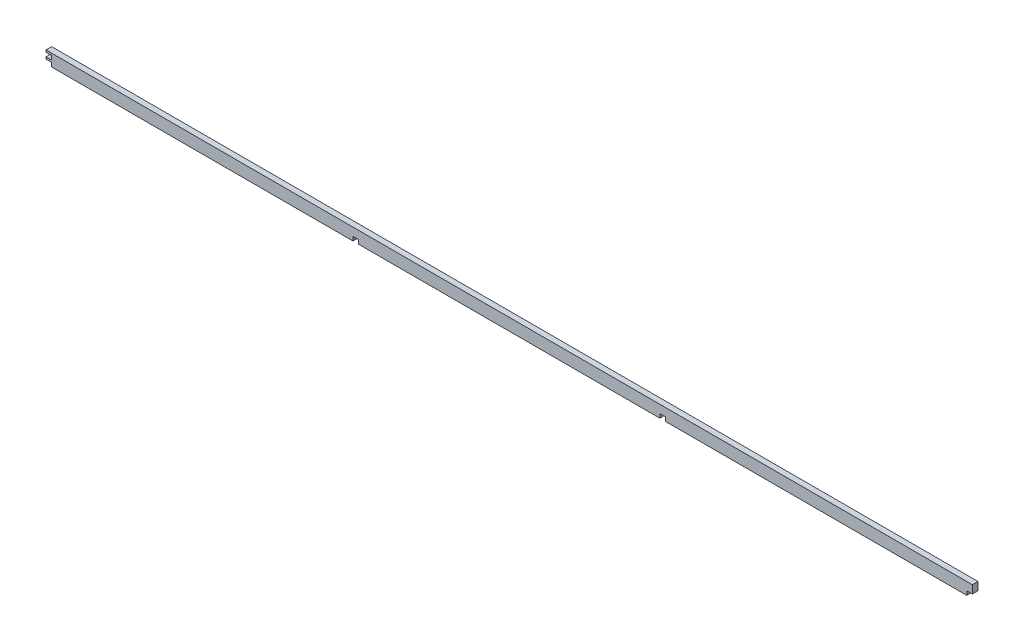
ISO-10303-21;
HEADER;
FILE_DESCRIPTION(('STEP AP214'),'2;1');
FILE_NAME('part.step','',(''),(''),'','','');
FILE_SCHEMA(('AUTOMOTIVE_DESIGN { 1 0 10303 214 1 1 1 1 }'));
ENDSEC;
DATA;
#1=APPLICATION_CONTEXT('core data for automotive mechanical design processes');
#2=APPLICATION_PROTOCOL_DEFINITION('international standard','automotive_design',2000,#1);
#3=PRODUCT_CONTEXT('',#1,'mechanical');
#4=PRODUCT('Part','Part','',(#3));
#5=PRODUCT_RELATED_PRODUCT_CATEGORY('part','',(#4));
#6=PRODUCT_DEFINITION_FORMATION('','',#4);
#7=PRODUCT_DEFINITION_CONTEXT('part definition',#1,'design');
#8=PRODUCT_DEFINITION('design','',#6,#7);
#9=PRODUCT_DEFINITION_SHAPE('','',#8);
#10=(LENGTH_UNIT() NAMED_UNIT(*) SI_UNIT(.MILLI.,.METRE.));
#11=(NAMED_UNIT(*) PLANE_ANGLE_UNIT() SI_UNIT($,.RADIAN.));
#12=(NAMED_UNIT(*) SI_UNIT($,.STERADIAN.) SOLID_ANGLE_UNIT());
#13=UNCERTAINTY_MEASURE_WITH_UNIT(LENGTH_MEASURE(1.E-05),#10,'distance_accuracy_value','');
#14=(GEOMETRIC_REPRESENTATION_CONTEXT(3) GLOBAL_UNCERTAINTY_ASSIGNED_CONTEXT((#13)) GLOBAL_UNIT_ASSIGNED_CONTEXT((#10,
#11,#12)) REPRESENTATION_CONTEXT('',''));
#15=CARTESIAN_POINT('',(0.,0.,0.));
#16=DIRECTION('',(0.,0.,1.));
#17=DIRECTION('',(1.,0.,0.));
#18=AXIS2_PLACEMENT_3D('',#15,#16,#17);
#19=CARTESIAN_POINT('',(229.199999999999,-0.999999999999996,1.4));
#20=DIRECTION('',(-1.,0.,0.));
#21=DIRECTION('',(0.,0.,1.));
#22=AXIS2_PLACEMENT_3D('',#19,#20,#21);
#23=PLANE('',#22);
#24=DIRECTION('',(0.,1.,0.));
#25=VECTOR('',#24,1.);
#26=CARTESIAN_POINT('',(229.199999999999,-0.999999999999996,-1.4));
#27=LINE('',#26,#25);
#28=CARTESIAN_POINT('',(229.199999999999,-0.999999999999996,-1.4));
#29=VERTEX_POINT('',#28);
#30=CARTESIAN_POINT('',(229.199999999999,3.,-1.4));
#31=VERTEX_POINT('',#30);
#32=EDGE_CURVE('E201',#29,#31,#27,.T.);
#33=ORIENTED_EDGE('',*,*,#32,.T.);
#34=DIRECTION('',(0.,0.,-1.));
#35=VECTOR('',#34,1.);
#36=CARTESIAN_POINT('',(229.199999999999,3.,1.4));
#37=LINE('',#36,#35);
#38=CARTESIAN_POINT('',(229.199999999999,3.,1.4));
#39=VERTEX_POINT('',#38);
#40=EDGE_CURVE('E11',#39,#31,#37,.T.);
#41=ORIENTED_EDGE('',*,*,#40,.F.);
#42=DIRECTION('',(0.,1.,0.));
#43=VECTOR('',#42,1.);
#44=CARTESIAN_POINT('',(229.199999999999,-0.999999999999996,1.4));
#45=LINE('',#44,#43);
#46=CARTESIAN_POINT('',(229.199999999999,-0.999999999999996,1.4));
#47=VERTEX_POINT('',#46);
#48=EDGE_CURVE('E239',#47,#39,#45,.T.);
#49=ORIENTED_EDGE('',*,*,#48,.F.);
#50=DIRECTION('',(0.,0.,-1.));
#51=VECTOR('',#50,1.);
#52=CARTESIAN_POINT('',(229.199999999999,-0.999999999999996,1.4));
#53=LINE('',#52,#51);
#54=EDGE_CURVE('E197',#47,#29,#53,.T.);
#55=ORIENTED_EDGE('',*,*,#54,.T.);
#56=EDGE_LOOP('',(#33,#41,#49,#55));
#57=FACE_BOUND('',#56,.T.);
#58=ADVANCED_FACE('F33',(#57),#23,.F.);
#59=CARTESIAN_POINT('',(-232.,3.,1.4));
#60=DIRECTION('',(0.,-1.,0.));
#61=DIRECTION('',(1.,0.,0.));
#62=AXIS2_PLACEMENT_3D('',#59,#60,#61);
#63=PLANE('',#62);
#64=DIRECTION('',(-1.,0.,0.));
#65=VECTOR('',#64,1.);
#66=CARTESIAN_POINT('',(-232.,3.,-1.4));
#67=LINE('',#66,#65);
#68=CARTESIAN_POINT('',(-232.,3.,-1.4));
#69=VERTEX_POINT('',#68);
#70=EDGE_CURVE('E204',#31,#69,#67,.T.);
#71=ORIENTED_EDGE('',*,*,#70,.T.);
#72=DIRECTION('',(0.,0.,-1.));
#73=VECTOR('',#72,1.);
#74=CARTESIAN_POINT('',(-232.,3.,1.4));
#75=LINE('',#74,#73);
#76=CARTESIAN_POINT('',(-232.,3.,1.4));
#77=VERTEX_POINT('',#76);
#78=EDGE_CURVE('E41',#77,#69,#75,.T.);
#79=ORIENTED_EDGE('',*,*,#78,.F.);
#80=DIRECTION('',(-1.,0.,0.));
#81=VECTOR('',#80,1.);
#82=CARTESIAN_POINT('',(-229.200000000001,3.,1.4));
#83=LINE('',#82,#81);
#84=EDGE_CURVE('E128',#39,#77,#83,.T.);
#85=ORIENTED_EDGE('',*,*,#84,.F.);
#86=ORIENTED_EDGE('',*,*,#40,.T.);
#87=EDGE_LOOP('',(#71,#79,#85,#86));
#88=FACE_BOUND('',#87,.T.);
#89=ADVANCED_FACE('F357',(#88),#63,.F.);
#90=CARTESIAN_POINT('',(-232.,2.,1.4));
#91=DIRECTION('',(1.,0.,0.));
#92=DIRECTION('',(0.,0.,-1.));
#93=AXIS2_PLACEMENT_3D('',#90,#91,#92);
#94=PLANE('',#93);
#95=DIRECTION('',(0.,-1.,0.));
#96=VECTOR('',#95,1.);
#97=CARTESIAN_POINT('',(-232.,2.,-1.4));
#98=LINE('',#97,#96);
#99=CARTESIAN_POINT('',(-232.,2.,-1.4));
#100=VERTEX_POINT('',#99);
#101=EDGE_CURVE('E206',#69,#100,#98,.T.);
#102=ORIENTED_EDGE('',*,*,#101,.T.);
#103=DIRECTION('',(0.,0.,-1.));
#104=VECTOR('',#103,1.);
#105=CARTESIAN_POINT('',(-232.,2.,1.4));
#106=LINE('',#105,#104);
#107=CARTESIAN_POINT('',(-232.,2.,1.4));
#108=VERTEX_POINT('',#107);
#109=EDGE_CURVE('E282',#108,#100,#106,.T.);
#110=ORIENTED_EDGE('',*,*,#109,.F.);
#111=DIRECTION('',(0.,-1.,0.));
#112=VECTOR('',#111,1.);
#113=CARTESIAN_POINT('',(-232.,2.,1.4));
#114=LINE('',#113,#112);
#115=EDGE_CURVE('E290',#77,#108,#114,.T.);
#116=ORIENTED_EDGE('',*,*,#115,.F.);
#117=ORIENTED_EDGE('',*,*,#78,.T.);
#118=EDGE_LOOP('',(#102,#110,#116,#117));
#119=FACE_BOUND('',#118,.T.);
#120=ADVANCED_FACE('F288',(#119),#94,.F.);
#121=CARTESIAN_POINT('',(-229.200000000001,2.,1.4));
#122=DIRECTION('',(0.,1.,0.));
#123=DIRECTION('',(-1.,0.,0.));
#124=AXIS2_PLACEMENT_3D('',#121,#122,#123);
#125=PLANE('',#124);
#126=DIRECTION('',(1.,0.,0.));
#127=VECTOR('',#126,1.);
#128=CARTESIAN_POINT('',(-229.200000000001,2.,-1.4));
#129=LINE('',#128,#127);
#130=CARTESIAN_POINT('',(-229.200000000001,2.,-1.4));
#131=VERTEX_POINT('',#130);
#132=EDGE_CURVE('E208',#100,#131,#129,.T.);
#133=ORIENTED_EDGE('',*,*,#132,.T.);
#134=DIRECTION('',(0.,0.,-1.));
#135=VECTOR('',#134,1.);
#136=CARTESIAN_POINT('',(-229.200000000001,2.,1.4));
#137=LINE('',#136,#135);
#138=CARTESIAN_POINT('',(-229.200000000001,2.,1.4));
#139=VERTEX_POINT('',#138);
#140=EDGE_CURVE('E279',#139,#131,#137,.T.);
#141=ORIENTED_EDGE('',*,*,#140,.F.);
#142=DIRECTION('',(1.,0.,0.));
#143=VECTOR('',#142,1.);
#144=CARTESIAN_POINT('',(-229.200000000001,2.,1.4));
#145=LINE('',#144,#143);
#146=EDGE_CURVE('E308',#108,#139,#145,.T.);
#147=ORIENTED_EDGE('',*,*,#146,.F.);
#148=ORIENTED_EDGE('',*,*,#109,.T.);
#149=EDGE_LOOP('',(#133,#141,#147,#148));
#150=FACE_BOUND('',#149,.T.);
#151=ADVANCED_FACE('F299',(#150),#125,.F.);
#152=CARTESIAN_POINT('',(-229.200000000001,0.,1.4));
#153=DIRECTION('',(1.,0.,0.));
#154=DIRECTION('',(0.,0.,-1.));
#155=AXIS2_PLACEMENT_3D('',#152,#153,#154);
#156=PLANE('',#155);
#157=DIRECTION('',(0.,-1.,0.));
#158=VECTOR('',#157,1.);
#159=CARTESIAN_POINT('',(-229.200000000001,0.,-1.4));
#160=LINE('',#159,#158);
#161=CARTESIAN_POINT('',(-229.200000000001,0.,-1.4));
#162=VERTEX_POINT('',#161);
#163=EDGE_CURVE('E210',#131,#162,#160,.T.);
#164=ORIENTED_EDGE('',*,*,#163,.T.);
#165=DIRECTION('',(0.,0.,-1.));
#166=VECTOR('',#165,1.);
#167=CARTESIAN_POINT('',(-229.200000000001,0.,1.4));
#168=LINE('',#167,#166);
#169=CARTESIAN_POINT('',(-229.200000000001,0.,1.4));
#170=VERTEX_POINT('',#169);
#171=EDGE_CURVE('E276',#170,#162,#168,.T.);
#172=ORIENTED_EDGE('',*,*,#171,.F.);
#173=DIRECTION('',(0.,-1.,0.));
#174=VECTOR('',#173,1.);
#175=CARTESIAN_POINT('',(-229.200000000001,0.,1.4));
#176=LINE('',#175,#174);
#177=EDGE_CURVE('E305',#139,#170,#176,.T.);
#178=ORIENTED_EDGE('',*,*,#177,.F.);
#179=ORIENTED_EDGE('',*,*,#140,.T.);
#180=EDGE_LOOP('',(#164,#172,#178,#179));
#181=FACE_BOUND('',#180,.T.);
#182=ADVANCED_FACE('F303',(#181),#156,.F.);
#183=CARTESIAN_POINT('',(-229.200000000001,0.,1.4));
#184=DIRECTION('',(0.,-1.,0.));
#185=DIRECTION('',(1.,0.,0.));
#186=AXIS2_PLACEMENT_3D('',#183,#184,#185);
#187=PLANE('',#186);
#188=DIRECTION('',(-1.,0.,0.));
#189=VECTOR('',#188,1.);
#190=CARTESIAN_POINT('',(-229.200000000001,0.,-1.4));
#191=LINE('',#190,#189);
#192=CARTESIAN_POINT('',(-232.,0.,-1.4));
#193=VERTEX_POINT('',#192);
#194=EDGE_CURVE('E212',#162,#193,#191,.T.);
#195=ORIENTED_EDGE('',*,*,#194,.T.);
#196=DIRECTION('',(0.,0.,-1.));
#197=VECTOR('',#196,1.);
#198=CARTESIAN_POINT('',(-232.,0.,1.4));
#199=LINE('',#198,#197);
#200=CARTESIAN_POINT('',(-232.,0.,1.4));
#201=VERTEX_POINT('',#200);
#202=EDGE_CURVE('E273',#201,#193,#199,.T.);
#203=ORIENTED_EDGE('',*,*,#202,.F.);
#204=DIRECTION('',(-1.,0.,0.));
#205=VECTOR('',#204,1.);
#206=CARTESIAN_POINT('',(-229.200000000001,0.,1.4));
#207=LINE('',#206,#205);
#208=EDGE_CURVE('E307',#170,#201,#207,.T.);
#209=ORIENTED_EDGE('',*,*,#208,.F.);
#210=ORIENTED_EDGE('',*,*,#171,.T.);
#211=EDGE_LOOP('',(#195,#203,#209,#210));
#212=FACE_BOUND('',#211,.T.);
#213=ADVANCED_FACE('F370',(#212),#187,.F.);
#214=CARTESIAN_POINT('',(-232.,0.,1.4));
#215=DIRECTION('',(1.,0.,0.));
#216=DIRECTION('',(0.,0.,-1.));
#217=AXIS2_PLACEMENT_3D('',#214,#215,#216);
#218=PLANE('',#217);
#219=DIRECTION('',(0.,-1.,0.));
#220=VECTOR('',#219,1.);
#221=CARTESIAN_POINT('',(-232.,0.,-1.4));
#222=LINE('',#221,#220);
#223=CARTESIAN_POINT('',(-232.,-0.999999999999996,-1.4));
#224=VERTEX_POINT('',#223);
#225=EDGE_CURVE('E214',#193,#224,#222,.T.);
#226=ORIENTED_EDGE('',*,*,#225,.T.);
#227=DIRECTION('',(0.,0.,-1.));
#228=VECTOR('',#227,1.);
#229=CARTESIAN_POINT('',(-232.,-0.999999999999996,1.4));
#230=LINE('',#229,#228);
#231=CARTESIAN_POINT('',(-232.,-0.999999999999996,1.4));
#232=VERTEX_POINT('',#231);
#233=EDGE_CURVE('E270',#232,#224,#230,.T.);
#234=ORIENTED_EDGE('',*,*,#233,.F.);
#235=DIRECTION('',(0.,-1.,0.));
#236=VECTOR('',#235,1.);
#237=CARTESIAN_POINT('',(-232.,0.,1.4));
#238=LINE('',#237,#236);
#239=EDGE_CURVE('E310',#201,#232,#238,.T.);
#240=ORIENTED_EDGE('',*,*,#239,.F.);
#241=ORIENTED_EDGE('',*,*,#202,.T.);
#242=EDGE_LOOP('',(#226,#234,#240,#241));
#243=FACE_BOUND('',#242,.T.);
#244=ADVANCED_FACE('F373',(#243),#218,.F.);
#245=CARTESIAN_POINT('',(-232.,-0.999999999999996,1.4));
#246=DIRECTION('',(0.,1.,0.));
#247=DIRECTION('',(-1.,0.,0.));
#248=AXIS2_PLACEMENT_3D('',#245,#246,#247);
#249=PLANE('',#248);
#250=DIRECTION('',(1.,0.,0.));
#251=VECTOR('',#250,1.);
#252=CARTESIAN_POINT('',(-232.,-0.999999999999996,-1.4));
#253=LINE('',#252,#251);
#254=CARTESIAN_POINT('',(-229.200000000001,-0.999999999999994,-1.4));
#255=VERTEX_POINT('',#254);
#256=EDGE_CURVE('E216',#224,#255,#253,.T.);
#257=ORIENTED_EDGE('',*,*,#256,.T.);
#258=DIRECTION('',(0.,0.,-1.));
#259=VECTOR('',#258,1.);
#260=CARTESIAN_POINT('',(-229.200000000001,-0.999999999999994,1.4));
#261=LINE('',#260,#259);
#262=CARTESIAN_POINT('',(-229.200000000001,-0.999999999999994,1.4));
#263=VERTEX_POINT('',#262);
#264=EDGE_CURVE('E267',#263,#255,#261,.T.);
#265=ORIENTED_EDGE('',*,*,#264,.F.);
#266=DIRECTION('',(1.,0.,0.));
#267=VECTOR('',#266,1.);
#268=CARTESIAN_POINT('',(-232.,-0.999999999999996,1.4));
#269=LINE('',#268,#267);
#270=EDGE_CURVE('E316',#232,#263,#269,.T.);
#271=ORIENTED_EDGE('',*,*,#270,.F.);
#272=ORIENTED_EDGE('',*,*,#233,.T.);
#273=EDGE_LOOP('',(#257,#265,#271,#272));
#274=FACE_BOUND('',#273,.T.);
#275=ADVANCED_FACE('F377',(#274),#249,.F.);
#276=CARTESIAN_POINT('',(-229.200000000001,-3.,1.4));
#277=DIRECTION('',(1.,0.,0.));
#278=DIRECTION('',(0.,0.,-1.));
#279=AXIS2_PLACEMENT_3D('',#276,#277,#278);
#280=PLANE('',#279);
#281=DIRECTION('',(0.,-1.,0.));
#282=VECTOR('',#281,1.);
#283=CARTESIAN_POINT('',(-229.200000000001,-3.,-1.4));
#284=LINE('',#283,#282);
#285=CARTESIAN_POINT('',(-229.200000000001,-3.,-1.4));
#286=VERTEX_POINT('',#285);
#287=EDGE_CURVE('E218',#255,#286,#284,.T.);
#288=ORIENTED_EDGE('',*,*,#287,.T.);
#289=DIRECTION('',(0.,0.,-1.));
#290=VECTOR('',#289,1.);
#291=CARTESIAN_POINT('',(-229.200000000001,-3.,1.4));
#292=LINE('',#291,#290);
#293=CARTESIAN_POINT('',(-229.200000000001,-3.,1.4));
#294=VERTEX_POINT('',#293);
#295=EDGE_CURVE('E264',#294,#286,#292,.T.);
#296=ORIENTED_EDGE('',*,*,#295,.F.);
#297=DIRECTION('',(0.,-1.,0.));
#298=VECTOR('',#297,1.);
#299=CARTESIAN_POINT('',(-229.200000000001,-3.,1.4));
#300=LINE('',#299,#298);
#301=EDGE_CURVE('E318',#263,#294,#300,.T.);
#302=ORIENTED_EDGE('',*,*,#301,.F.);
#303=ORIENTED_EDGE('',*,*,#264,.T.);
#304=EDGE_LOOP('',(#288,#296,#302,#303));
#305=FACE_BOUND('',#304,.T.);
#306=ADVANCED_FACE('F381',(#305),#280,.F.);
#307=CARTESIAN_POINT('',(-229.200000000001,-3.,1.4));
#308=DIRECTION('',(0.,1.,0.));
#309=DIRECTION('',(-1.,0.,0.));
#310=AXIS2_PLACEMENT_3D('',#307,#308,#309);
#311=PLANE('',#310);
#312=DIRECTION('',(1.,0.,0.));
#313=VECTOR('',#312,1.);
#314=CARTESIAN_POINT('',(-229.200000000001,-3.,-1.4));
#315=LINE('',#314,#313);
#316=CARTESIAN_POINT('',(-79.2000000000005,-2.99999999999999,-1.4));
#317=VERTEX_POINT('',#316);
#318=EDGE_CURVE('E220',#286,#317,#315,.T.);
#319=ORIENTED_EDGE('',*,*,#318,.T.);
#320=DIRECTION('',(0.,0.,-1.));
#321=VECTOR('',#320,1.);
#322=CARTESIAN_POINT('',(-79.2000000000005,-2.99999999999999,1.4));
#323=LINE('',#322,#321);
#324=CARTESIAN_POINT('',(-79.2000000000005,-2.99999999999999,1.4));
#325=VERTEX_POINT('',#324);
#326=EDGE_CURVE('E261',#325,#317,#323,.T.);
#327=ORIENTED_EDGE('',*,*,#326,.F.);
#328=DIRECTION('',(1.,0.,0.));
#329=VECTOR('',#328,1.);
#330=CARTESIAN_POINT('',(-229.200000000001,-3.,1.4));
#331=LINE('',#330,#329);
#332=EDGE_CURVE('E320',#294,#325,#331,.T.);
#333=ORIENTED_EDGE('',*,*,#332,.F.);
#334=ORIENTED_EDGE('',*,*,#295,.T.);
#335=EDGE_LOOP('',(#319,#327,#333,#334));
#336=FACE_BOUND('',#335,.T.);
#337=ADVANCED_FACE('F385',(#336),#311,.F.);
#338=CARTESIAN_POINT('',(-79.2000000000005,-2.99999999999999,1.4));
#339=DIRECTION('',(-1.,0.,0.));
#340=DIRECTION('',(0.,0.,1.));
#341=AXIS2_PLACEMENT_3D('',#338,#339,#340);
#342=PLANE('',#341);
#343=DIRECTION('',(0.,1.,0.));
#344=VECTOR('',#343,1.);
#345=CARTESIAN_POINT('',(-79.2000000000005,-2.99999999999999,-1.4));
#346=LINE('',#345,#344);
#347=CARTESIAN_POINT('',(-79.2000000000005,-0.999999999999996,-1.4));
#348=VERTEX_POINT('',#347);
#349=EDGE_CURVE('E222',#317,#348,#346,.T.);
#350=ORIENTED_EDGE('',*,*,#349,.T.);
#351=DIRECTION('',(0.,0.,-1.));
#352=VECTOR('',#351,1.);
#353=CARTESIAN_POINT('',(-79.2000000000005,-0.999999999999996,1.4));
#354=LINE('',#353,#352);
#355=CARTESIAN_POINT('',(-79.2000000000005,-0.999999999999996,1.4));
#356=VERTEX_POINT('',#355);
#357=EDGE_CURVE('E258',#356,#348,#354,.T.);
#358=ORIENTED_EDGE('',*,*,#357,.F.);
#359=DIRECTION('',(0.,1.,0.));
#360=VECTOR('',#359,1.);
#361=CARTESIAN_POINT('',(-79.2000000000005,-2.99999999999999,1.4));
#362=LINE('',#361,#360);
#363=EDGE_CURVE('E322',#325,#356,#362,.T.);
#364=ORIENTED_EDGE('',*,*,#363,.F.);
#365=ORIENTED_EDGE('',*,*,#326,.T.);
#366=EDGE_LOOP('',(#350,#358,#364,#365));
#367=FACE_BOUND('',#366,.T.);
#368=ADVANCED_FACE('F389',(#367),#342,.F.);
#369=CARTESIAN_POINT('',(-79.2000000000005,-0.999999999999996,1.4));
#370=DIRECTION('',(0.,1.,0.));
#371=DIRECTION('',(0.,0.,1.));
#372=AXIS2_PLACEMENT_3D('',#369,#370,#371);
#373=PLANE('',#372);
#374=DIRECTION('',(1.,0.,0.));
#375=VECTOR('',#374,1.);
#376=CARTESIAN_POINT('',(-79.2000000000005,-0.999999999999996,-1.4));
#377=LINE('',#376,#375);
#378=CARTESIAN_POINT('',(-76.4000000000005,-0.999999999999996,-1.4));
#379=VERTEX_POINT('',#378);
#380=EDGE_CURVE('E224',#348,#379,#377,.T.);
#381=ORIENTED_EDGE('',*,*,#380,.T.);
#382=DIRECTION('',(0.,0.,-1.));
#383=VECTOR('',#382,1.);
#384=CARTESIAN_POINT('',(-76.4000000000005,-0.999999999999996,1.4));
#385=LINE('',#384,#383);
#386=CARTESIAN_POINT('',(-76.4000000000005,-0.999999999999996,1.4));
#387=VERTEX_POINT('',#386);
#388=EDGE_CURVE('E255',#387,#379,#385,.T.);
#389=ORIENTED_EDGE('',*,*,#388,.F.);
#390=DIRECTION('',(1.,0.,0.));
#391=VECTOR('',#390,1.);
#392=CARTESIAN_POINT('',(-79.2000000000005,-0.999999999999996,1.4));
#393=LINE('',#392,#391);
#394=EDGE_CURVE('E324',#356,#387,#393,.T.);
#395=ORIENTED_EDGE('',*,*,#394,.F.);
#396=ORIENTED_EDGE('',*,*,#357,.T.);
#397=EDGE_LOOP('',(#381,#389,#395,#396));
#398=FACE_BOUND('',#397,.T.);
#399=ADVANCED_FACE('F393',(#398),#373,.F.);
#400=CARTESIAN_POINT('',(-76.4000000000005,-0.999999999999996,1.4));
#401=DIRECTION('',(1.,0.,0.));
#402=DIRECTION('',(0.,0.,-1.));
#403=AXIS2_PLACEMENT_3D('',#400,#401,#402);
#404=PLANE('',#403);
#405=DIRECTION('',(0.,-1.,0.));
#406=VECTOR('',#405,1.);
#407=CARTESIAN_POINT('',(-76.4000000000005,-0.999999999999996,-1.4));
#408=LINE('',#407,#406);
#409=CARTESIAN_POINT('',(-76.4000000000005,-2.99999999999999,-1.4));
#410=VERTEX_POINT('',#409);
#411=EDGE_CURVE('E226',#379,#410,#408,.T.);
#412=ORIENTED_EDGE('',*,*,#411,.T.);
#413=DIRECTION('',(0.,0.,-1.));
#414=VECTOR('',#413,1.);
#415=CARTESIAN_POINT('',(-76.4000000000005,-2.99999999999999,1.4));
#416=LINE('',#415,#414);
#417=CARTESIAN_POINT('',(-76.4000000000005,-2.99999999999999,1.4));
#418=VERTEX_POINT('',#417);
#419=EDGE_CURVE('E252',#418,#410,#416,.T.);
#420=ORIENTED_EDGE('',*,*,#419,.F.);
#421=DIRECTION('',(0.,-1.,0.));
#422=VECTOR('',#421,1.);
#423=CARTESIAN_POINT('',(-76.4000000000005,-0.999999999999996,1.4));
#424=LINE('',#423,#422);
#425=EDGE_CURVE('E326',#387,#418,#424,.T.);
#426=ORIENTED_EDGE('',*,*,#425,.F.);
#427=ORIENTED_EDGE('',*,*,#388,.T.);
#428=EDGE_LOOP('',(#412,#420,#426,#427));
#429=FACE_BOUND('',#428,.T.);
#430=ADVANCED_FACE('F397',(#429),#404,.F.);
#431=CARTESIAN_POINT('',(-76.4000000000005,-2.99999999999999,1.4));
#432=DIRECTION('',(0.,1.,0.));
#433=DIRECTION('',(-1.,0.,0.));
#434=AXIS2_PLACEMENT_3D('',#431,#432,#433);
#435=PLANE('',#434);
#436=DIRECTION('',(1.,0.,0.));
#437=VECTOR('',#436,1.);
#438=CARTESIAN_POINT('',(-76.4000000000005,-2.99999999999999,-1.4));
#439=LINE('',#438,#437);
#440=CARTESIAN_POINT('',(73.5999999999995,-2.99999999999999,-1.4));
#441=VERTEX_POINT('',#440);
#442=EDGE_CURVE('E228',#410,#441,#439,.T.);
#443=ORIENTED_EDGE('',*,*,#442,.T.);
#444=DIRECTION('',(0.,0.,-1.));
#445=VECTOR('',#444,1.);
#446=CARTESIAN_POINT('',(73.5999999999995,-2.99999999999999,1.4));
#447=LINE('',#446,#445);
#448=CARTESIAN_POINT('',(73.5999999999995,-2.99999999999999,1.4));
#449=VERTEX_POINT('',#448);
#450=EDGE_CURVE('E249',#449,#441,#447,.T.);
#451=ORIENTED_EDGE('',*,*,#450,.F.);
#452=DIRECTION('',(1.,0.,0.));
#453=VECTOR('',#452,1.);
#454=CARTESIAN_POINT('',(-76.4000000000005,-2.99999999999999,1.4));
#455=LINE('',#454,#453);
#456=EDGE_CURVE('E328',#418,#449,#455,.T.);
#457=ORIENTED_EDGE('',*,*,#456,.F.);
#458=ORIENTED_EDGE('',*,*,#419,.T.);
#459=EDGE_LOOP('',(#443,#451,#457,#458));
#460=FACE_BOUND('',#459,.T.);
#461=ADVANCED_FACE('F401',(#460),#435,.F.);
#462=CARTESIAN_POINT('',(73.5999999999995,-2.99999999999999,1.4));
#463=DIRECTION('',(-1.,0.,0.));
#464=DIRECTION('',(0.,0.,1.));
#465=AXIS2_PLACEMENT_3D('',#462,#463,#464);
#466=PLANE('',#465);
#467=DIRECTION('',(0.,1.,0.));
#468=VECTOR('',#467,1.);
#469=CARTESIAN_POINT('',(73.5999999999995,-2.99999999999999,-1.4));
#470=LINE('',#469,#468);
#471=CARTESIAN_POINT('',(73.5999999999995,-0.999999999999996,-1.4));
#472=VERTEX_POINT('',#471);
#473=EDGE_CURVE('E230',#441,#472,#470,.T.);
#474=ORIENTED_EDGE('',*,*,#473,.T.);
#475=DIRECTION('',(0.,0.,-1.));
#476=VECTOR('',#475,1.);
#477=CARTESIAN_POINT('',(73.5999999999995,-0.999999999999996,1.4));
#478=LINE('',#477,#476);
#479=CARTESIAN_POINT('',(73.5999999999995,-0.999999999999996,1.4));
#480=VERTEX_POINT('',#479);
#481=EDGE_CURVE('E246',#480,#472,#478,.T.);
#482=ORIENTED_EDGE('',*,*,#481,.F.);
#483=DIRECTION('',(0.,1.,0.));
#484=VECTOR('',#483,1.);
#485=CARTESIAN_POINT('',(73.5999999999995,-2.99999999999999,1.4));
#486=LINE('',#485,#484);
#487=EDGE_CURVE('E330',#449,#480,#486,.T.);
#488=ORIENTED_EDGE('',*,*,#487,.F.);
#489=ORIENTED_EDGE('',*,*,#450,.T.);
#490=EDGE_LOOP('',(#474,#482,#488,#489));
#491=FACE_BOUND('',#490,.T.);
#492=ADVANCED_FACE('F405',(#491),#466,.F.);
#493=CARTESIAN_POINT('',(73.5999999999995,-0.999999999999996,1.4));
#494=DIRECTION('',(0.,1.,0.));
#495=DIRECTION('',(0.,0.,1.));
#496=AXIS2_PLACEMENT_3D('',#493,#494,#495);
#497=PLANE('',#496);
#498=DIRECTION('',(1.,0.,0.));
#499=VECTOR('',#498,1.);
#500=CARTESIAN_POINT('',(73.5999999999995,-0.999999999999996,-1.4));
#501=LINE('',#500,#499);
#502=CARTESIAN_POINT('',(76.3999999999995,-0.999999999999996,-1.4));
#503=VERTEX_POINT('',#502);
#504=EDGE_CURVE('E232',#472,#503,#501,.T.);
#505=ORIENTED_EDGE('',*,*,#504,.T.);
#506=DIRECTION('',(0.,0.,-1.));
#507=VECTOR('',#506,1.);
#508=CARTESIAN_POINT('',(76.3999999999995,-0.999999999999996,1.4));
#509=LINE('',#508,#507);
#510=CARTESIAN_POINT('',(76.3999999999995,-0.999999999999996,1.4));
#511=VERTEX_POINT('',#510);
#512=EDGE_CURVE('E243',#511,#503,#509,.T.);
#513=ORIENTED_EDGE('',*,*,#512,.F.);
#514=DIRECTION('',(1.,0.,0.));
#515=VECTOR('',#514,1.);
#516=CARTESIAN_POINT('',(73.5999999999995,-0.999999999999996,1.4));
#517=LINE('',#516,#515);
#518=EDGE_CURVE('E332',#480,#511,#517,.T.);
#519=ORIENTED_EDGE('',*,*,#518,.F.);
#520=ORIENTED_EDGE('',*,*,#481,.T.);
#521=EDGE_LOOP('',(#505,#513,#519,#520));
#522=FACE_BOUND('',#521,.T.);
#523=ADVANCED_FACE('F338',(#522),#497,.F.);
#524=CARTESIAN_POINT('',(76.3999999999995,-0.999999999999996,1.4));
#525=DIRECTION('',(1.,0.,0.));
#526=DIRECTION('',(0.,0.,-1.));
#527=AXIS2_PLACEMENT_3D('',#524,#525,#526);
#528=PLANE('',#527);
#529=DIRECTION('',(0.,-1.,0.));
#530=VECTOR('',#529,1.);
#531=CARTESIAN_POINT('',(76.3999999999995,-0.999999999999996,-1.4));
#532=LINE('',#531,#530);
#533=CARTESIAN_POINT('',(76.3999999999995,-2.99999999999999,-1.4));
#534=VERTEX_POINT('',#533);
#535=EDGE_CURVE('E234',#503,#534,#532,.T.);
#536=ORIENTED_EDGE('',*,*,#535,.T.);
#537=DIRECTION('',(0.,0.,-1.));
#538=VECTOR('',#537,1.);
#539=CARTESIAN_POINT('',(76.3999999999995,-2.99999999999999,1.4));
#540=LINE('',#539,#538);
#541=CARTESIAN_POINT('',(76.3999999999995,-2.99999999999999,1.4));
#542=VERTEX_POINT('',#541);
#543=EDGE_CURVE('E192',#542,#534,#540,.T.);
#544=ORIENTED_EDGE('',*,*,#543,.F.);
#545=DIRECTION('',(0.,-1.,0.));
#546=VECTOR('',#545,1.);
#547=CARTESIAN_POINT('',(76.3999999999995,-0.999999999999996,1.4));
#548=LINE('',#547,#546);
#549=EDGE_CURVE('E183',#511,#542,#548,.T.);
#550=ORIENTED_EDGE('',*,*,#549,.F.);
#551=ORIENTED_EDGE('',*,*,#512,.T.);
#552=EDGE_LOOP('',(#536,#544,#550,#551));
#553=FACE_BOUND('',#552,.T.);
#554=ADVANCED_FACE('F342',(#553),#528,.F.);
#555=CARTESIAN_POINT('',(76.3999999999995,-2.99999999999999,1.4));
#556=DIRECTION('',(0.,1.,0.));
#557=DIRECTION('',(-1.,0.,0.));
#558=AXIS2_PLACEMENT_3D('',#555,#556,#557);
#559=PLANE('',#558);
#560=DIRECTION('',(1.,0.,0.));
#561=VECTOR('',#560,1.);
#562=CARTESIAN_POINT('',(76.3999999999995,-2.99999999999999,-1.4));
#563=LINE('',#562,#561);
#564=CARTESIAN_POINT('',(226.399999999999,-3.,-1.4));
#565=VERTEX_POINT('',#564);
#566=EDGE_CURVE('E191',#534,#565,#563,.T.);
#567=ORIENTED_EDGE('',*,*,#566,.T.);
#568=DIRECTION('',(0.,0.,-1.));
#569=VECTOR('',#568,1.);
#570=CARTESIAN_POINT('',(226.399999999999,-3.,1.4));
#571=LINE('',#570,#569);
#572=CARTESIAN_POINT('',(226.399999999999,-3.,1.4));
#573=VERTEX_POINT('',#572);
#574=EDGE_CURVE('E188',#573,#565,#571,.T.);
#575=ORIENTED_EDGE('',*,*,#574,.F.);
#576=DIRECTION('',(1.,0.,0.));
#577=VECTOR('',#576,1.);
#578=CARTESIAN_POINT('',(76.3999999999995,-2.99999999999999,1.4));
#579=LINE('',#578,#577);
#580=EDGE_CURVE('E177',#542,#573,#579,.T.);
#581=ORIENTED_EDGE('',*,*,#580,.F.);
#582=ORIENTED_EDGE('',*,*,#543,.T.);
#583=EDGE_LOOP('',(#567,#575,#581,#582));
#584=FACE_BOUND('',#583,.T.);
#585=ADVANCED_FACE('F189',(#584),#559,.F.);
#586=CARTESIAN_POINT('',(226.399999999999,-3.,1.4));
#587=DIRECTION('',(-1.,0.,0.));
#588=DIRECTION('',(0.,0.,1.));
#589=AXIS2_PLACEMENT_3D('',#586,#587,#588);
#590=PLANE('',#589);
#591=DIRECTION('',(0.,1.,0.));
#592=VECTOR('',#591,1.);
#593=CARTESIAN_POINT('',(226.399999999999,-3.,-1.4));
#594=LINE('',#593,#592);
#595=CARTESIAN_POINT('',(226.399999999999,-0.999999999999996,-1.4));
#596=VERTEX_POINT('',#595);
#597=EDGE_CURVE('E114',#565,#596,#594,.T.);
#598=ORIENTED_EDGE('',*,*,#597,.T.);
#599=DIRECTION('',(0.,0.,-1.));
#600=VECTOR('',#599,1.);
#601=CARTESIAN_POINT('',(226.399999999999,-0.999999999999996,1.4));
#602=LINE('',#601,#600);
#603=CARTESIAN_POINT('',(226.399999999999,-0.999999999999996,1.4));
#604=VERTEX_POINT('',#603);
#605=EDGE_CURVE('E193',#604,#596,#602,.T.);
#606=ORIENTED_EDGE('',*,*,#605,.F.);
#607=DIRECTION('',(0.,1.,0.));
#608=VECTOR('',#607,1.);
#609=CARTESIAN_POINT('',(226.399999999999,-3.,1.4));
#610=LINE('',#609,#608);
#611=EDGE_CURVE('E181',#573,#604,#610,.T.);
#612=ORIENTED_EDGE('',*,*,#611,.F.);
#613=ORIENTED_EDGE('',*,*,#574,.T.);
#614=EDGE_LOOP('',(#598,#606,#612,#613));
#615=FACE_BOUND('',#614,.T.);
#616=ADVANCED_FACE('F195',(#615),#590,.F.);
#617=CARTESIAN_POINT('',(226.399999999999,-0.999999999999996,1.4));
#618=DIRECTION('',(0.,1.,0.));
#619=DIRECTION('',(0.,0.,1.));
#620=AXIS2_PLACEMENT_3D('',#617,#618,#619);
#621=PLANE('',#620);
#622=DIRECTION('',(1.,0.,0.));
#623=VECTOR('',#622,1.);
#624=CARTESIAN_POINT('',(226.399999999999,-0.999999999999996,-1.4));
#625=LINE('',#624,#623);
#626=EDGE_CURVE('E120',#596,#29,#625,.T.);
#627=ORIENTED_EDGE('',*,*,#626,.T.);
#628=ORIENTED_EDGE('',*,*,#54,.F.);
#629=DIRECTION('',(1.,0.,0.));
#630=VECTOR('',#629,1.);
#631=CARTESIAN_POINT('',(226.399999999999,-0.999999999999996,1.4));
#632=LINE('',#631,#630);
#633=EDGE_CURVE('E49',#604,#47,#632,.T.);
#634=ORIENTED_EDGE('',*,*,#633,.F.);
#635=ORIENTED_EDGE('',*,*,#605,.T.);
#636=EDGE_LOOP('',(#627,#628,#634,#635));
#637=FACE_BOUND('',#636,.T.);
#638=ADVANCED_FACE('F346',(#637),#621,.F.);
#639=CARTESIAN_POINT('',(0.,0.,1.4));
#640=DIRECTION('',(0.,0.,-1.));
#641=DIRECTION('',(-1.,0.,0.));
#642=AXIS2_PLACEMENT_3D('',#639,#640,#641);
#643=PLANE('',#642);
#644=ORIENTED_EDGE('',*,*,#48,.T.);
#645=ORIENTED_EDGE('',*,*,#84,.T.);
#646=ORIENTED_EDGE('',*,*,#115,.T.);
#647=ORIENTED_EDGE('',*,*,#146,.T.);
#648=ORIENTED_EDGE('',*,*,#177,.T.);
#649=ORIENTED_EDGE('',*,*,#208,.T.);
#650=ORIENTED_EDGE('',*,*,#239,.T.);
#651=ORIENTED_EDGE('',*,*,#270,.T.);
#652=ORIENTED_EDGE('',*,*,#301,.T.);
#653=ORIENTED_EDGE('',*,*,#332,.T.);
#654=ORIENTED_EDGE('',*,*,#363,.T.);
#655=ORIENTED_EDGE('',*,*,#394,.T.);
#656=ORIENTED_EDGE('',*,*,#425,.T.);
#657=ORIENTED_EDGE('',*,*,#456,.T.);
#658=ORIENTED_EDGE('',*,*,#487,.T.);
#659=ORIENTED_EDGE('',*,*,#518,.T.);
#660=ORIENTED_EDGE('',*,*,#549,.T.);
#661=ORIENTED_EDGE('',*,*,#580,.T.);
#662=ORIENTED_EDGE('',*,*,#611,.T.);
#663=ORIENTED_EDGE('',*,*,#633,.T.);
#664=EDGE_LOOP('',(#644,#645,#646,#647,#648,#649,#650,#651,#652,#653,#654,#655,#656,#657,#658,
#659,#660,#661,#662,#663));
#665=FACE_BOUND('',#664,.T.);
#666=ADVANCED_FACE('F179',(#665),#643,.F.);
#667=CARTESIAN_POINT('',(0.,0.,-1.4));
#668=DIRECTION('',(0.,0.,-1.));
#669=DIRECTION('',(-1.,0.,0.));
#670=AXIS2_PLACEMENT_3D('',#667,#668,#669);
#671=PLANE('',#670);
#672=ORIENTED_EDGE('',*,*,#32,.F.);
#673=ORIENTED_EDGE('',*,*,#626,.F.);
#674=ORIENTED_EDGE('',*,*,#597,.F.);
#675=ORIENTED_EDGE('',*,*,#566,.F.);
#676=ORIENTED_EDGE('',*,*,#535,.F.);
#677=ORIENTED_EDGE('',*,*,#504,.F.);
#678=ORIENTED_EDGE('',*,*,#473,.F.);
#679=ORIENTED_EDGE('',*,*,#442,.F.);
#680=ORIENTED_EDGE('',*,*,#411,.F.);
#681=ORIENTED_EDGE('',*,*,#380,.F.);
#682=ORIENTED_EDGE('',*,*,#349,.F.);
#683=ORIENTED_EDGE('',*,*,#318,.F.);
#684=ORIENTED_EDGE('',*,*,#287,.F.);
#685=ORIENTED_EDGE('',*,*,#256,.F.);
#686=ORIENTED_EDGE('',*,*,#225,.F.);
#687=ORIENTED_EDGE('',*,*,#194,.F.);
#688=ORIENTED_EDGE('',*,*,#163,.F.);
#689=ORIENTED_EDGE('',*,*,#132,.F.);
#690=ORIENTED_EDGE('',*,*,#101,.F.);
#691=ORIENTED_EDGE('',*,*,#70,.F.);
#692=EDGE_LOOP('',(#672,#673,#674,#675,#676,#677,#678,#679,#680,#681,#682,#683,#684,#685,#686,
#687,#688,#689,#690,#691));
#693=FACE_BOUND('',#692,.T.);
#694=ADVANCED_FACE('F294',(#693),#671,.T.);
#695=CLOSED_SHELL('',(#58,#89,#120,#151,#182,#213,#244,#275,#306,#337,#368,#399,#430,#461,#492,
#523,#554,#585,#616,#638,#666,#694));
#696=MANIFOLD_SOLID_BREP('B2',#695);
#697=ADVANCED_BREP_SHAPE_REPRESENTATION('',(#18,#696),#14);
#698=SHAPE_DEFINITION_REPRESENTATION(#9,#697);
ENDSEC;
END-ISO-10303-21;
